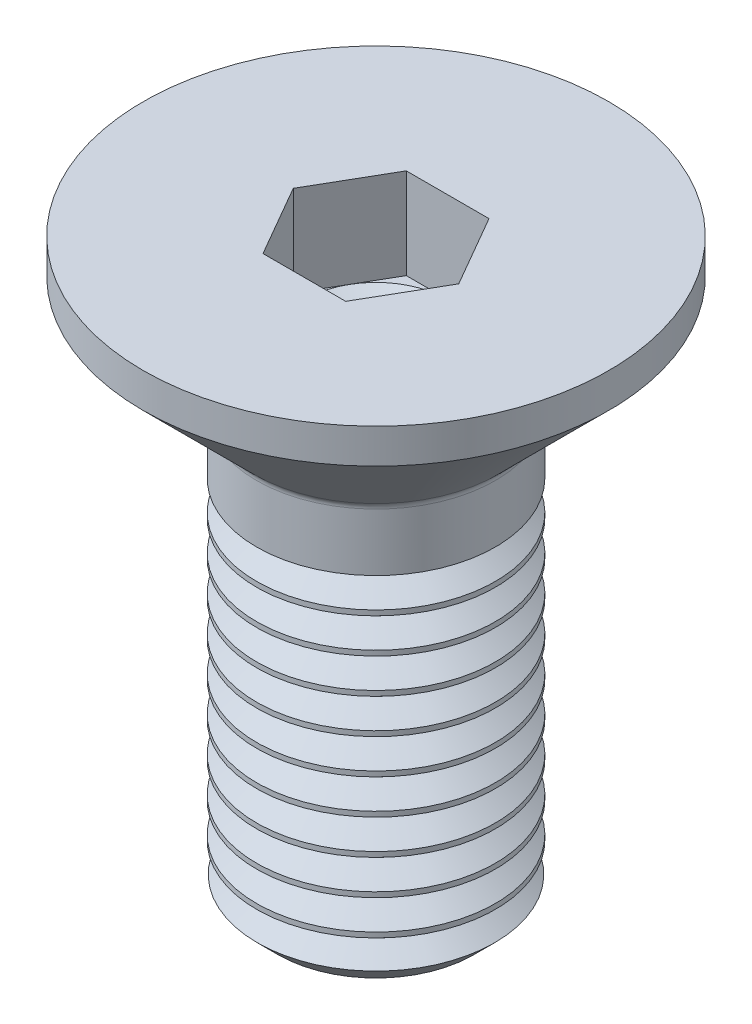
ISO-10303-21;
HEADER;
FILE_DESCRIPTION(('STEP AP214'),'2;1');
FILE_NAME('part.step','',(''),(''),'','','');
FILE_SCHEMA(('AUTOMOTIVE_DESIGN { 1 0 10303 214 1 1 1 1 }'));
ENDSEC;
DATA;
#1=APPLICATION_CONTEXT('core data for automotive mechanical design processes');
#2=APPLICATION_PROTOCOL_DEFINITION('international standard','automotive_design',2000,#1);
#3=PRODUCT_CONTEXT('',#1,'mechanical');
#4=PRODUCT('Part','Part','',(#3));
#5=PRODUCT_RELATED_PRODUCT_CATEGORY('part','',(#4));
#6=PRODUCT_DEFINITION_FORMATION('','',#4);
#7=PRODUCT_DEFINITION_CONTEXT('part definition',#1,'design');
#8=PRODUCT_DEFINITION('design','',#6,#7);
#9=PRODUCT_DEFINITION_SHAPE('','',#8);
#10=(LENGTH_UNIT() NAMED_UNIT(*) SI_UNIT(.MILLI.,.METRE.));
#11=(NAMED_UNIT(*) PLANE_ANGLE_UNIT() SI_UNIT($,.RADIAN.));
#12=(NAMED_UNIT(*) SI_UNIT($,.STERADIAN.) SOLID_ANGLE_UNIT());
#13=UNCERTAINTY_MEASURE_WITH_UNIT(LENGTH_MEASURE(1.E-05),#10,'distance_accuracy_value','');
#14=(GEOMETRIC_REPRESENTATION_CONTEXT(3) GLOBAL_UNCERTAINTY_ASSIGNED_CONTEXT((#13)) GLOBAL_UNIT_ASSIGNED_CONTEXT((#10,
#11,#12)) REPRESENTATION_CONTEXT('',''));
#15=CARTESIAN_POINT('',(0.,0.,0.));
#16=DIRECTION('',(0.,0.,1.));
#17=DIRECTION('',(1.,0.,0.));
#18=AXIS2_PLACEMENT_3D('',#15,#16,#17);
#19=CARTESIAN_POINT('',(5.99999999999416,6.00000000000003,0.));
#20=DIRECTION('',(-9.73290892325451E-13,1.,0.));
#21=DIRECTION('',(0.,0.,1.));
#22=AXIS2_PLACEMENT_3D('',#19,#20,#21);
#23=PLANE('',#22);
#24=CARTESIAN_POINT('',(5.99999999999416,6.00000000000003,0.));
#25=DIRECTION('',(-9.73290892325451E-13,1.,0.));
#26=DIRECTION('',(0.,0.,1.));
#27=AXIS2_PLACEMENT_3D('',#24,#25,#26);
#28=CIRCLE('',#27,4.875);
#29=CARTESIAN_POINT('',(5.99999999999416,6.00000000000003,4.875));
#30=VERTEX_POINT('',#29);
#31=EDGE_CURVE('E172',#30,#30,#28,.T.);
#32=ORIENTED_EDGE('',*,*,#31,.T.);
#33=EDGE_LOOP('',(#32));
#34=FACE_BOUND('',#33,.T.);
#35=DIRECTION('',(-0.5,-4.86645446162725E-13,-0.866025403784439));
#36=VECTOR('',#35,1.);
#37=CARTESIAN_POINT('',(5.13397459620972,5.99999999999918,1.5));
#38=LINE('',#37,#36);
#39=CARTESIAN_POINT('',(5.13397459620972,5.99999999999918,1.5));
#40=VERTEX_POINT('',#39);
#41=CARTESIAN_POINT('',(4.26794919242528,5.99999999999834,0.));
#42=VERTEX_POINT('',#41);
#43=EDGE_CURVE('E134',#40,#42,#38,.T.);
#44=ORIENTED_EDGE('',*,*,#43,.T.);
#45=DIRECTION('',(0.5,4.86645446162725E-13,-0.866025403784439));
#46=VECTOR('',#45,1.);
#47=CARTESIAN_POINT('',(4.26794919242528,5.99999999999834,0.));
#48=LINE('',#47,#46);
#49=CARTESIAN_POINT('',(5.13397459620972,5.99999999999918,-1.5));
#50=VERTEX_POINT('',#49);
#51=EDGE_CURVE('E64',#42,#50,#48,.T.);
#52=ORIENTED_EDGE('',*,*,#51,.T.);
#53=DIRECTION('',(1.,9.73290892325451E-13,0.));
#54=VECTOR('',#53,1.);
#55=CARTESIAN_POINT('',(5.13397459620972,5.99999999999918,-1.5));
#56=LINE('',#55,#54);
#57=CARTESIAN_POINT('',(6.86602540377859,6.00000000000087,-1.5));
#58=VERTEX_POINT('',#57);
#59=EDGE_CURVE('E146',#50,#58,#56,.T.);
#60=ORIENTED_EDGE('',*,*,#59,.T.);
#61=DIRECTION('',(0.500000000000001,4.86645446162726E-13,0.866025403784439));
#62=VECTOR('',#61,1.);
#63=CARTESIAN_POINT('',(6.86602540377859,6.00000000000087,-1.5));
#64=LINE('',#63,#62);
#65=CARTESIAN_POINT('',(7.73205080756303,6.00000000000171,0.));
#66=VERTEX_POINT('',#65);
#67=EDGE_CURVE('E476',#58,#66,#64,.T.);
#68=ORIENTED_EDGE('',*,*,#67,.T.);
#69=DIRECTION('',(-0.5,-4.86645446162726E-13,0.866025403784438));
#70=VECTOR('',#69,1.);
#71=CARTESIAN_POINT('',(7.73205080756303,6.00000000000171,0.));
#72=LINE('',#71,#70);
#73=CARTESIAN_POINT('',(6.86602540377859,6.00000000000087,1.5));
#74=VERTEX_POINT('',#73);
#75=EDGE_CURVE('E480',#66,#74,#72,.T.);
#76=ORIENTED_EDGE('',*,*,#75,.T.);
#77=DIRECTION('',(-1.,-9.73290892325451E-13,0.));
#78=VECTOR('',#77,1.);
#79=CARTESIAN_POINT('',(6.86602540377859,6.00000000000087,1.5));
#80=LINE('',#79,#78);
#81=EDGE_CURVE('E484',#74,#40,#80,.T.);
#82=ORIENTED_EDGE('',*,*,#81,.T.);
#83=EDGE_LOOP('',(#44,#52,#60,#68,#76,#82));
#84=FACE_BOUND('',#83,.T.);
#85=ADVANCED_FACE('F47',(#34,#84),#23,.T.);
#86=CARTESIAN_POINT('',(5.99999999999416,6.00000000000003,0.));
#87=DIRECTION('',(-9.73290892325451E-13,1.,0.));
#88=DIRECTION('',(0.,0.,1.));
#89=AXIS2_PLACEMENT_3D('',#86,#87,#88);
#90=CYLINDRICAL_SURFACE('',#89,4.875);
#91=CARTESIAN_POINT('',(5.99999999999486,5.27500000000002,0.));
#92=DIRECTION('',(-9.73290892325451E-13,1.,0.));
#93=DIRECTION('',(0.,0.,1.));
#94=AXIS2_PLACEMENT_3D('',#91,#92,#93);
#95=CIRCLE('',#94,4.875);
#96=CARTESIAN_POINT('',(5.99999999999486,5.27500000000002,4.875));
#97=VERTEX_POINT('',#96);
#98=EDGE_CURVE('E168',#97,#97,#95,.T.);
#99=ORIENTED_EDGE('',*,*,#98,.T.);
#100=EDGE_LOOP('',(#99));
#101=FACE_BOUND('',#100,.T.);
#102=ORIENTED_EDGE('',*,*,#31,.F.);
#103=EDGE_LOOP('',(#102));
#104=FACE_BOUND('',#103,.T.);
#105=ADVANCED_FACE('F198',(#101,#104),#90,.T.);
#106=CARTESIAN_POINT('',(5.99999999999486,5.27500000000002,0.));
#107=DIRECTION('',(-9.73290892325451E-13,1.,0.));
#108=DIRECTION('',(0.,0.,1.));
#109=AXIS2_PLACEMENT_3D('',#106,#107,#108);
#110=CONICAL_SURFACE('',#109,4.875,0.78539816339745);
#111=CARTESIAN_POINT('',(5.99999999999712,2.95857864376272,0.));
#112=DIRECTION('',(-9.73290892325451E-13,1.,0.));
#113=DIRECTION('',(0.,0.,1.));
#114=AXIS2_PLACEMENT_3D('',#111,#112,#113);
#115=CIRCLE('',#114,2.5585786437627);
#116=CARTESIAN_POINT('',(5.99999999999712,2.95857864376272,2.5585786437627));
#117=VERTEX_POINT('',#116);
#118=EDGE_CURVE('E57',#117,#117,#115,.T.);
#119=ORIENTED_EDGE('',*,*,#118,.T.);
#120=EDGE_LOOP('',(#119));
#121=FACE_BOUND('',#120,.T.);
#122=ORIENTED_EDGE('',*,*,#98,.F.);
#123=EDGE_LOOP('',(#122));
#124=FACE_BOUND('',#123,.T.);
#125=ADVANCED_FACE('F180',(#121,#124),#110,.T.);
#126=CARTESIAN_POINT('',(5.99999999999416,6.00000000000003,0.));
#127=DIRECTION('',(-9.73290892325451E-13,1.,0.));
#128=DIRECTION('',(0.,0.,1.));
#129=AXIS2_PLACEMENT_3D('',#126,#127,#128);
#130=CYLINDRICAL_SURFACE('',#129,2.5);
#131=CARTESIAN_POINT('',(5.99999999999843,1.61159135450335,0.));
#132=DIRECTION('',(-9.73413352960834E-13,1.,0.));
#133=DIRECTION('',(-1.,-9.73413352960834E-13,0.));
#134=AXIS2_PLACEMENT_3D('',#131,#132,#133);
#135=CIRCLE('',#134,2.5);
#136=CARTESIAN_POINT('',(3.49999999999843,1.61159135450091,0.));
#137=VERTEX_POINT('',#136);
#138=EDGE_CURVE('E443',#137,#137,#135,.T.);
#139=ORIENTED_EDGE('',*,*,#138,.T.);
#140=EDGE_LOOP('',(#139));
#141=FACE_BOUND('',#140,.T.);
#142=CARTESIAN_POINT('',(5.99999999999725,2.81715728752541,0.));
#143=DIRECTION('',(-9.73290892325451E-13,1.,0.));
#144=DIRECTION('',(0.,0.,1.));
#145=AXIS2_PLACEMENT_3D('',#142,#143,#144);
#146=CIRCLE('',#145,2.5);
#147=CARTESIAN_POINT('',(5.99999999999725,2.81715728752541,2.5));
#148=VERTEX_POINT('',#147);
#149=EDGE_CURVE('E11',#148,#148,#146,.F.);
#150=ORIENTED_EDGE('',*,*,#149,.T.);
#151=EDGE_LOOP('',(#150));
#152=FACE_BOUND('',#151,.T.);
#153=ADVANCED_FACE('F184',(#141,#152),#130,.T.);
#154=CARTESIAN_POINT('',(5.99999999999725,2.81715728752541,0.));
#155=DIRECTION('',(-9.73290892325451E-13,1.,0.));
#156=DIRECTION('',(0.,0.,1.));
#157=AXIS2_PLACEMENT_3D('',#154,#155,#156);
#158=TOROIDAL_SURFACE('',#157,2.70000000000001,0.2);
#159=ORIENTED_EDGE('',*,*,#149,.F.);
#160=EDGE_LOOP('',(#159));
#161=FACE_BOUND('',#160,.T.);
#162=ORIENTED_EDGE('',*,*,#118,.F.);
#163=EDGE_LOOP('',(#162));
#164=FACE_BOUND('',#163,.T.);
#165=ADVANCED_FACE('F49',(#161,#164),#158,.F.);
#166=CARTESIAN_POINT('',(4.26794919242713,4.09999999999834,0.));
#167=DIRECTION('',(0.866025403784439,8.42894638025866E-13,0.5));
#168=DIRECTION('',(-0.5,-4.86645446162725E-13,0.866025403784439));
#169=AXIS2_PLACEMENT_3D('',#166,#167,#168);
#170=PLANE('',#169);
#171=ORIENTED_EDGE('',*,*,#51,.F.);
#172=DIRECTION('',(-9.73290892325451E-13,1.,0.));
#173=VECTOR('',#172,1.);
#174=CARTESIAN_POINT('',(4.26794919242713,4.09999999999834,0.));
#175=LINE('',#174,#173);
#176=CARTESIAN_POINT('',(4.26794919242713,4.09999999999834,0.));
#177=VERTEX_POINT('',#176);
#178=EDGE_CURVE('E471',#177,#42,#175,.T.);
#179=ORIENTED_EDGE('',*,*,#178,.F.);
#180=DIRECTION('',(0.5,4.86645446162725E-13,-0.866025403784439));
#181=VECTOR('',#180,1.);
#182=CARTESIAN_POINT('',(4.26794919242713,4.09999999999834,0.));
#183=LINE('',#182,#181);
#184=CARTESIAN_POINT('',(4.70096189431935,4.09999999999876,-0.75));
#185=VERTEX_POINT('',#184);
#186=EDGE_CURVE('E129',#177,#185,#183,.T.);
#187=ORIENTED_EDGE('',*,*,#186,.T.);
#188=CARTESIAN_POINT('',(5.13397459621156,4.09999999999918,-1.5));
#189=VERTEX_POINT('',#188);
#190=EDGE_CURVE('E125',#185,#189,#183,.T.);
#191=ORIENTED_EDGE('',*,*,#190,.T.);
#192=DIRECTION('',(-9.73290892325451E-13,1.,0.));
#193=VECTOR('',#192,1.);
#194=CARTESIAN_POINT('',(5.13397459621156,4.09999999999918,-1.5));
#195=LINE('',#194,#193);
#196=EDGE_CURVE('E127',#189,#50,#195,.T.);
#197=ORIENTED_EDGE('',*,*,#196,.T.);
#198=EDGE_LOOP('',(#171,#179,#187,#191,#197));
#199=FACE_BOUND('',#198,.T.);
#200=ADVANCED_FACE('F126',(#199),#170,.T.);
#201=CARTESIAN_POINT('',(5.13397459621156,4.09999999999918,-1.5));
#202=DIRECTION('',(0.,0.,1.));
#203=DIRECTION('',(-1.,-9.73290892325451E-13,0.));
#204=AXIS2_PLACEMENT_3D('',#201,#202,#203);
#205=PLANE('',#204);
#206=ORIENTED_EDGE('',*,*,#59,.F.);
#207=ORIENTED_EDGE('',*,*,#196,.F.);
#208=DIRECTION('',(1.,9.73290892325451E-13,0.));
#209=VECTOR('',#208,1.);
#210=CARTESIAN_POINT('',(5.13397459621156,4.09999999999918,-1.5));
#211=LINE('',#210,#209);
#212=CARTESIAN_POINT('',(5.999999999996,4.10000000000003,-1.5));
#213=VERTEX_POINT('',#212);
#214=EDGE_CURVE('E72',#189,#213,#211,.T.);
#215=ORIENTED_EDGE('',*,*,#214,.T.);
#216=CARTESIAN_POINT('',(6.86602540378044,4.10000000000087,-1.5));
#217=VERTEX_POINT('',#216);
#218=EDGE_CURVE('E141',#213,#217,#211,.T.);
#219=ORIENTED_EDGE('',*,*,#218,.T.);
#220=DIRECTION('',(-9.73290892325451E-13,1.,0.));
#221=VECTOR('',#220,1.);
#222=CARTESIAN_POINT('',(6.86602540378044,4.10000000000087,-1.5));
#223=LINE('',#222,#221);
#224=EDGE_CURVE('E149',#217,#58,#223,.T.);
#225=ORIENTED_EDGE('',*,*,#224,.T.);
#226=EDGE_LOOP('',(#206,#207,#215,#219,#225));
#227=FACE_BOUND('',#226,.T.);
#228=ADVANCED_FACE('F143',(#227),#205,.T.);
#229=CARTESIAN_POINT('',(6.86602540378044,4.10000000000087,-1.5));
#230=DIRECTION('',(-0.866025403784439,-8.42894638025865E-13,0.5));
#231=DIRECTION('',(-0.500000000000001,-4.86645446162726E-13,-0.866025403784438));
#232=AXIS2_PLACEMENT_3D('',#229,#230,#231);
#233=PLANE('',#232);
#234=ORIENTED_EDGE('',*,*,#67,.F.);
#235=ORIENTED_EDGE('',*,*,#224,.F.);
#236=DIRECTION('',(0.500000000000001,4.86645446162726E-13,0.866025403784439));
#237=VECTOR('',#236,1.);
#238=CARTESIAN_POINT('',(6.86602540378044,4.10000000000087,-1.5));
#239=LINE('',#238,#237);
#240=CARTESIAN_POINT('',(7.29903810567266,4.10000000000129,-0.75));
#241=VERTEX_POINT('',#240);
#242=EDGE_CURVE('E452',#217,#241,#239,.T.);
#243=ORIENTED_EDGE('',*,*,#242,.T.);
#244=CARTESIAN_POINT('',(7.73205080756488,4.10000000000171,0.));
#245=VERTEX_POINT('',#244);
#246=EDGE_CURVE('E140',#241,#245,#239,.T.);
#247=ORIENTED_EDGE('',*,*,#246,.T.);
#248=DIRECTION('',(-9.73290892325451E-13,1.,0.));
#249=VECTOR('',#248,1.);
#250=CARTESIAN_POINT('',(7.73205080756488,4.10000000000171,0.));
#251=LINE('',#250,#249);
#252=EDGE_CURVE('E157',#245,#66,#251,.T.);
#253=ORIENTED_EDGE('',*,*,#252,.T.);
#254=EDGE_LOOP('',(#234,#235,#243,#247,#253));
#255=FACE_BOUND('',#254,.T.);
#256=ADVANCED_FACE('F226',(#255),#233,.T.);
#257=CARTESIAN_POINT('',(7.73205080756488,4.10000000000171,0.));
#258=DIRECTION('',(-0.866025403784439,-8.42894638025866E-13,-0.5));
#259=DIRECTION('',(0.5,4.86645446162726E-13,-0.866025403784439));
#260=AXIS2_PLACEMENT_3D('',#257,#258,#259);
#261=PLANE('',#260);
#262=ORIENTED_EDGE('',*,*,#75,.F.);
#263=ORIENTED_EDGE('',*,*,#252,.F.);
#264=DIRECTION('',(-0.5,-4.86645446162726E-13,0.866025403784438));
#265=VECTOR('',#264,1.);
#266=CARTESIAN_POINT('',(7.73205080756488,4.10000000000171,0.));
#267=LINE('',#266,#265);
#268=CARTESIAN_POINT('',(7.29903810567266,4.10000000000129,0.75));
#269=VERTEX_POINT('',#268);
#270=EDGE_CURVE('E457',#245,#269,#267,.T.);
#271=ORIENTED_EDGE('',*,*,#270,.T.);
#272=CARTESIAN_POINT('',(6.86602540378044,4.10000000000087,1.5));
#273=VERTEX_POINT('',#272);
#274=EDGE_CURVE('E456',#269,#273,#267,.T.);
#275=ORIENTED_EDGE('',*,*,#274,.T.);
#276=DIRECTION('',(-9.73290892325451E-13,1.,0.));
#277=VECTOR('',#276,1.);
#278=CARTESIAN_POINT('',(6.86602540378044,4.10000000000087,1.5));
#279=LINE('',#278,#277);
#280=EDGE_CURVE('E497',#273,#74,#279,.T.);
#281=ORIENTED_EDGE('',*,*,#280,.T.);
#282=EDGE_LOOP('',(#262,#263,#271,#275,#281));
#283=FACE_BOUND('',#282,.T.);
#284=ADVANCED_FACE('F229',(#283),#261,.T.);
#285=CARTESIAN_POINT('',(6.86602540378044,4.10000000000087,1.5));
#286=DIRECTION('',(0.,0.,-1.));
#287=DIRECTION('',(-9.73290892325451E-13,1.,0.));
#288=AXIS2_PLACEMENT_3D('',#285,#286,#287);
#289=PLANE('',#288);
#290=ORIENTED_EDGE('',*,*,#81,.F.);
#291=ORIENTED_EDGE('',*,*,#280,.F.);
#292=DIRECTION('',(-1.,-9.73290892325451E-13,0.));
#293=VECTOR('',#292,1.);
#294=CARTESIAN_POINT('',(6.86602540378044,4.10000000000087,1.5));
#295=LINE('',#294,#293);
#296=CARTESIAN_POINT('',(5.999999999996,4.10000000000003,1.5));
#297=VERTEX_POINT('',#296);
#298=EDGE_CURVE('E462',#273,#297,#295,.T.);
#299=ORIENTED_EDGE('',*,*,#298,.T.);
#300=CARTESIAN_POINT('',(5.13397459621156,4.09999999999918,1.5));
#301=VERTEX_POINT('',#300);
#302=EDGE_CURVE('E461',#297,#301,#295,.T.);
#303=ORIENTED_EDGE('',*,*,#302,.T.);
#304=DIRECTION('',(-9.73290892325451E-13,1.,0.));
#305=VECTOR('',#304,1.);
#306=CARTESIAN_POINT('',(5.13397459621156,4.09999999999918,1.5));
#307=LINE('',#306,#305);
#308=EDGE_CURVE('E493',#301,#40,#307,.T.);
#309=ORIENTED_EDGE('',*,*,#308,.T.);
#310=EDGE_LOOP('',(#290,#291,#299,#303,#309));
#311=FACE_BOUND('',#310,.T.);
#312=ADVANCED_FACE('F233',(#311),#289,.T.);
#313=CARTESIAN_POINT('',(5.13397459621156,4.09999999999918,1.5));
#314=DIRECTION('',(0.866025403784439,8.42894638025866E-13,-0.5));
#315=DIRECTION('',(0.5,4.86645446162726E-13,0.866025403784439));
#316=AXIS2_PLACEMENT_3D('',#313,#314,#315);
#317=PLANE('',#316);
#318=ORIENTED_EDGE('',*,*,#43,.F.);
#319=ORIENTED_EDGE('',*,*,#308,.F.);
#320=DIRECTION('',(-0.5,-4.86645446162725E-13,-0.866025403784439));
#321=VECTOR('',#320,1.);
#322=CARTESIAN_POINT('',(5.13397459621156,4.09999999999918,1.5));
#323=LINE('',#322,#321);
#324=CARTESIAN_POINT('',(4.70096189431935,4.09999999999876,0.75));
#325=VERTEX_POINT('',#324);
#326=EDGE_CURVE('E467',#301,#325,#323,.T.);
#327=ORIENTED_EDGE('',*,*,#326,.T.);
#328=EDGE_CURVE('E466',#325,#177,#323,.T.);
#329=ORIENTED_EDGE('',*,*,#328,.T.);
#330=ORIENTED_EDGE('',*,*,#178,.T.);
#331=EDGE_LOOP('',(#318,#319,#327,#329,#330));
#332=FACE_BOUND('',#331,.T.);
#333=ADVANCED_FACE('F237',(#332),#317,.T.);
#334=CARTESIAN_POINT('',(5.13397459621156,4.09999999999918,-1.5));
#335=DIRECTION('',(9.73290892325451E-13,-1.,0.));
#336=DIRECTION('',(0.,0.,-1.));
#337=AXIS2_PLACEMENT_3D('',#334,#335,#336);
#338=PLANE('',#337);
#339=ORIENTED_EDGE('',*,*,#214,.F.);
#340=ORIENTED_EDGE('',*,*,#190,.F.);
#341=CARTESIAN_POINT('',(5.999999999996,4.10000000000003,0.));
#342=DIRECTION('',(-9.73290892325451E-13,1.,0.));
#343=DIRECTION('',(0.,0.,1.));
#344=AXIS2_PLACEMENT_3D('',#341,#342,#343);
#345=CIRCLE('',#344,1.5);
#346=EDGE_CURVE('E137',#213,#185,#345,.T.);
#347=ORIENTED_EDGE('',*,*,#346,.F.);
#348=EDGE_LOOP('',(#339,#340,#347));
#349=FACE_BOUND('',#348,.T.);
#350=ADVANCED_FACE('F136',(#349),#338,.F.);
#351=ORIENTED_EDGE('',*,*,#186,.F.);
#352=ORIENTED_EDGE('',*,*,#328,.F.);
#353=EDGE_CURVE('E154',#185,#325,#345,.T.);
#354=ORIENTED_EDGE('',*,*,#353,.F.);
#355=EDGE_LOOP('',(#351,#352,#354));
#356=FACE_BOUND('',#355,.T.);
#357=ADVANCED_FACE('F244',(#356),#338,.F.);
#358=ORIENTED_EDGE('',*,*,#326,.F.);
#359=ORIENTED_EDGE('',*,*,#302,.F.);
#360=EDGE_CURVE('E148',#325,#297,#345,.T.);
#361=ORIENTED_EDGE('',*,*,#360,.F.);
#362=EDGE_LOOP('',(#358,#359,#361));
#363=FACE_BOUND('',#362,.T.);
#364=ADVANCED_FACE('F536',(#363),#338,.F.);
#365=ORIENTED_EDGE('',*,*,#298,.F.);
#366=ORIENTED_EDGE('',*,*,#274,.F.);
#367=EDGE_CURVE('E156',#297,#269,#345,.T.);
#368=ORIENTED_EDGE('',*,*,#367,.F.);
#369=EDGE_LOOP('',(#365,#366,#368));
#370=FACE_BOUND('',#369,.T.);
#371=ADVANCED_FACE('F534',(#370),#338,.F.);
#372=ORIENTED_EDGE('',*,*,#270,.F.);
#373=ORIENTED_EDGE('',*,*,#246,.F.);
#374=EDGE_CURVE('E164',#269,#241,#345,.T.);
#375=ORIENTED_EDGE('',*,*,#374,.F.);
#376=EDGE_LOOP('',(#372,#373,#375));
#377=FACE_BOUND('',#376,.T.);
#378=ADVANCED_FACE('F530',(#377),#338,.F.);
#379=ORIENTED_EDGE('',*,*,#242,.F.);
#380=ORIENTED_EDGE('',*,*,#218,.F.);
#381=EDGE_CURVE('E526',#241,#213,#345,.T.);
#382=ORIENTED_EDGE('',*,*,#381,.F.);
#383=EDGE_LOOP('',(#379,#380,#382));
#384=FACE_BOUND('',#383,.T.);
#385=ADVANCED_FACE('F221',(#384),#338,.F.);
#386=CARTESIAN_POINT('',(5.999999999996,4.10000000000003,0.));
#387=DIRECTION('',(-9.73290892325451E-13,1.,0.));
#388=DIRECTION('',(0.,0.,1.));
#389=AXIS2_PLACEMENT_3D('',#386,#387,#388);
#390=CONICAL_SURFACE('',#389,1.5,1.04719755119659);
#391=CARTESIAN_POINT('',(5.99999999999685,3.23397459621558,0.));
#392=VERTEX_POINT('',#391);
#393=VERTEX_LOOP('',#392);
#394=FACE_BOUND('',#393,.T.);
#395=ORIENTED_EDGE('',*,*,#367,.T.);
#396=ORIENTED_EDGE('',*,*,#374,.T.);
#397=ORIENTED_EDGE('',*,*,#381,.T.);
#398=ORIENTED_EDGE('',*,*,#346,.T.);
#399=ORIENTED_EDGE('',*,*,#353,.T.);
#400=ORIENTED_EDGE('',*,*,#360,.T.);
#401=EDGE_LOOP('',(#395,#396,#397,#398,#399,#400));
#402=FACE_BOUND('',#401,.T.);
#403=ADVANCED_FACE('F218',(#394,#402),#390,.F.);
#404=CARTESIAN_POINT('',(5.99999999999903,0.988406645496705,0.));
#405=DIRECTION('',(9.73413352960834E-13,-1.,0.));
#406=DIRECTION('',(1.,9.73413352960834E-13,0.));
#407=AXIS2_PLACEMENT_3D('',#404,#405,#406);
#408=CONICAL_SURFACE('',#407,2.5,0.959931088596883);
#409=CARTESIAN_POINT('',(5.99999999999873,1.29999900000002,0.));
#410=DIRECTION('',(-9.73413352960834E-13,1.,0.));
#411=DIRECTION('',(-1.,-9.73413352960834E-13,0.));
#412=AXIS2_PLACEMENT_3D('',#409,#410,#411);
#413=CIRCLE('',#412,2.055);
#414=CARTESIAN_POINT('',(3.94499999999873,1.29999899999802,0.));
#415=VERTEX_POINT('',#414);
#416=EDGE_CURVE('E439',#415,#415,#413,.T.);
#417=ORIENTED_EDGE('',*,*,#416,.F.);
#418=EDGE_LOOP('',(#417));
#419=FACE_BOUND('',#418,.T.);
#420=CARTESIAN_POINT('',(5.99999999999903,0.988406645496705,0.));
#421=DIRECTION('',(-9.73413352960834E-13,1.,0.));
#422=DIRECTION('',(-1.,-9.73413352960834E-13,0.));
#423=AXIS2_PLACEMENT_3D('',#420,#421,#422);
#424=CIRCLE('',#423,2.5);
#425=CARTESIAN_POINT('',(3.49999999999903,0.988406645494271,0.));
#426=VERTEX_POINT('',#425);
#427=EDGE_CURVE('E447',#426,#426,#424,.T.);
#428=ORIENTED_EDGE('',*,*,#427,.T.);
#429=EDGE_LOOP('',(#428));
#430=FACE_BOUND('',#429,.T.);
#431=ADVANCED_FACE('F220',(#419,#430),#408,.T.);
#432=CARTESIAN_POINT('',(5.99999999999873,1.29999900000002,0.));
#433=DIRECTION('',(-9.73413352960834E-13,1.,0.));
#434=DIRECTION('',(-1.,-9.73413352960834E-13,0.));
#435=AXIS2_PLACEMENT_3D('',#432,#433,#434);
#436=CONICAL_SURFACE('',#435,2.055,0.959931088596877);
#437=ORIENTED_EDGE('',*,*,#138,.F.);
#438=EDGE_LOOP('',(#437));
#439=FACE_BOUND('',#438,.T.);
#440=ORIENTED_EDGE('',*,*,#416,.T.);
#441=EDGE_LOOP('',(#440));
#442=FACE_BOUND('',#441,.T.);
#443=ADVANCED_FACE('F247',(#439,#442),#436,.T.);
#444=CARTESIAN_POINT('',(5.99999999999914,0.881591354503349,0.));
#445=DIRECTION('',(-9.73413352960834E-13,1.,0.));
#446=DIRECTION('',(-1.,-9.73413352960834E-13,0.));
#447=AXIS2_PLACEMENT_3D('',#444,#445,#446);
#448=CIRCLE('',#447,2.5);
#449=CARTESIAN_POINT('',(3.49999999999914,0.881591354500915,0.));
#450=VERTEX_POINT('',#449);
#451=EDGE_CURVE('E431',#450,#450,#448,.T.);
#452=ORIENTED_EDGE('',*,*,#451,.T.);
#453=EDGE_LOOP('',(#452));
#454=FACE_BOUND('',#453,.T.);
#455=ORIENTED_EDGE('',*,*,#427,.F.);
#456=EDGE_LOOP('',(#455));
#457=FACE_BOUND('',#456,.T.);
#458=ADVANCED_FACE('F195',(#454,#457),#130,.T.);
#459=CARTESIAN_POINT('',(5.99999999999975,0.258406645496705,0.));
#460=DIRECTION('',(9.73413352960834E-13,-1.,0.));
#461=DIRECTION('',(1.,9.73413352960834E-13,0.));
#462=AXIS2_PLACEMENT_3D('',#459,#460,#461);
#463=CONICAL_SURFACE('',#462,2.5,0.959931088596883);
#464=CARTESIAN_POINT('',(5.99999999999944,0.569999000000025,0.));
#465=DIRECTION('',(-9.73413352960834E-13,1.,0.));
#466=DIRECTION('',(-1.,-9.73413352960834E-13,0.));
#467=AXIS2_PLACEMENT_3D('',#464,#465,#466);
#468=CIRCLE('',#467,2.055);
#469=CARTESIAN_POINT('',(3.94499999999944,0.569998999998025,0.));
#470=VERTEX_POINT('',#469);
#471=EDGE_CURVE('E427',#470,#470,#468,.T.);
#472=ORIENTED_EDGE('',*,*,#471,.F.);
#473=EDGE_LOOP('',(#472));
#474=FACE_BOUND('',#473,.T.);
#475=CARTESIAN_POINT('',(5.99999999999975,0.258406645496705,0.));
#476=DIRECTION('',(-9.73413352960834E-13,1.,0.));
#477=DIRECTION('',(-1.,-9.73413352960834E-13,0.));
#478=AXIS2_PLACEMENT_3D('',#475,#476,#477);
#479=CIRCLE('',#478,2.5);
#480=CARTESIAN_POINT('',(3.49999999999974,0.258406645494271,0.));
#481=VERTEX_POINT('',#480);
#482=EDGE_CURVE('E435',#481,#481,#479,.T.);
#483=ORIENTED_EDGE('',*,*,#482,.T.);
#484=EDGE_LOOP('',(#483));
#485=FACE_BOUND('',#484,.T.);
#486=ADVANCED_FACE('F252',(#474,#485),#463,.T.);
#487=CARTESIAN_POINT('',(5.99999999999944,0.569999000000025,0.));
#488=DIRECTION('',(-9.73413352960834E-13,1.,0.));
#489=DIRECTION('',(-1.,-9.73413352960834E-13,0.));
#490=AXIS2_PLACEMENT_3D('',#487,#488,#489);
#491=CONICAL_SURFACE('',#490,2.055,0.959931088596877);
#492=ORIENTED_EDGE('',*,*,#451,.F.);
#493=EDGE_LOOP('',(#492));
#494=FACE_BOUND('',#493,.T.);
#495=ORIENTED_EDGE('',*,*,#471,.T.);
#496=EDGE_LOOP('',(#495));
#497=FACE_BOUND('',#496,.T.);
#498=ADVANCED_FACE('F255',(#494,#497),#491,.T.);
#499=CARTESIAN_POINT('',(5.99999999999985,0.151591354503349,0.));
#500=DIRECTION('',(-9.73413352960834E-13,1.,0.));
#501=DIRECTION('',(-1.,-9.73413352960834E-13,0.));
#502=AXIS2_PLACEMENT_3D('',#499,#500,#501);
#503=CIRCLE('',#502,2.5);
#504=CARTESIAN_POINT('',(3.49999999999985,0.151591354500915,0.));
#505=VERTEX_POINT('',#504);
#506=EDGE_CURVE('E419',#505,#505,#503,.T.);
#507=ORIENTED_EDGE('',*,*,#506,.T.);
#508=EDGE_LOOP('',(#507));
#509=FACE_BOUND('',#508,.T.);
#510=ORIENTED_EDGE('',*,*,#482,.F.);
#511=EDGE_LOOP('',(#510));
#512=FACE_BOUND('',#511,.T.);
#513=ADVANCED_FACE('F259',(#509,#512),#130,.T.);
#514=CARTESIAN_POINT('',(6.00000000000046,-0.471593354503296,0.));
#515=DIRECTION('',(9.73413352960834E-13,-1.,0.));
#516=DIRECTION('',(1.,9.73413352960834E-13,0.));
#517=AXIS2_PLACEMENT_3D('',#514,#515,#516);
#518=CONICAL_SURFACE('',#517,2.5,0.959931088596883);
#519=CARTESIAN_POINT('',(6.00000000000015,-0.160000999999976,0.));
#520=DIRECTION('',(-9.73413352960834E-13,1.,0.));
#521=DIRECTION('',(-1.,-9.73413352960834E-13,0.));
#522=AXIS2_PLACEMENT_3D('',#519,#520,#521);
#523=CIRCLE('',#522,2.055);
#524=CARTESIAN_POINT('',(3.94500000000015,-0.160001000001976,0.));
#525=VERTEX_POINT('',#524);
#526=EDGE_CURVE('E415',#525,#525,#523,.T.);
#527=ORIENTED_EDGE('',*,*,#526,.F.);
#528=EDGE_LOOP('',(#527));
#529=FACE_BOUND('',#528,.T.);
#530=CARTESIAN_POINT('',(6.00000000000046,-0.471593354503296,0.));
#531=DIRECTION('',(-9.73413352960834E-13,1.,0.));
#532=DIRECTION('',(-1.,-9.73413352960834E-13,0.));
#533=AXIS2_PLACEMENT_3D('',#530,#531,#532);
#534=CIRCLE('',#533,2.5);
#535=CARTESIAN_POINT('',(3.50000000000045,-0.471593354505729,0.));
#536=VERTEX_POINT('',#535);
#537=EDGE_CURVE('E423',#536,#536,#534,.T.);
#538=ORIENTED_EDGE('',*,*,#537,.T.);
#539=EDGE_LOOP('',(#538));
#540=FACE_BOUND('',#539,.T.);
#541=ADVANCED_FACE('F261',(#529,#540),#518,.T.);
#542=CARTESIAN_POINT('',(6.00000000000015,-0.160000999999976,0.));
#543=DIRECTION('',(-9.73413352960834E-13,1.,0.));
#544=DIRECTION('',(-1.,-9.73413352960834E-13,0.));
#545=AXIS2_PLACEMENT_3D('',#542,#543,#544);
#546=CONICAL_SURFACE('',#545,2.055,0.959931088596877);
#547=ORIENTED_EDGE('',*,*,#506,.F.);
#548=EDGE_LOOP('',(#547));
#549=FACE_BOUND('',#548,.T.);
#550=ORIENTED_EDGE('',*,*,#526,.T.);
#551=EDGE_LOOP('',(#550));
#552=FACE_BOUND('',#551,.T.);
#553=ADVANCED_FACE('F264',(#549,#552),#546,.T.);
#554=CARTESIAN_POINT('',(6.00000000000056,-0.578408645496652,0.));
#555=DIRECTION('',(-9.73413352960834E-13,1.,0.));
#556=DIRECTION('',(-1.,-9.73413352960834E-13,0.));
#557=AXIS2_PLACEMENT_3D('',#554,#555,#556);
#558=CIRCLE('',#557,2.5);
#559=CARTESIAN_POINT('',(3.50000000000056,-0.578408645499086,0.));
#560=VERTEX_POINT('',#559);
#561=EDGE_CURVE('E407',#560,#560,#558,.T.);
#562=ORIENTED_EDGE('',*,*,#561,.T.);
#563=EDGE_LOOP('',(#562));
#564=FACE_BOUND('',#563,.T.);
#565=ORIENTED_EDGE('',*,*,#537,.F.);
#566=EDGE_LOOP('',(#565));
#567=FACE_BOUND('',#566,.T.);
#568=ADVANCED_FACE('F268',(#564,#567),#130,.T.);
#569=CARTESIAN_POINT('',(6.00000000000117,-1.2015933545033,0.));
#570=DIRECTION('',(9.73413352960834E-13,-1.,0.));
#571=DIRECTION('',(1.,9.73413352960834E-13,0.));
#572=AXIS2_PLACEMENT_3D('',#569,#570,#571);
#573=CONICAL_SURFACE('',#572,2.5,0.959931088596883);
#574=CARTESIAN_POINT('',(6.00000000000086,-0.890000999999976,0.));
#575=DIRECTION('',(-9.73413352960834E-13,1.,0.));
#576=DIRECTION('',(-1.,-9.73413352960834E-13,0.));
#577=AXIS2_PLACEMENT_3D('',#574,#575,#576);
#578=CIRCLE('',#577,2.055);
#579=CARTESIAN_POINT('',(3.94500000000086,-0.890001000001977,0.));
#580=VERTEX_POINT('',#579);
#581=EDGE_CURVE('E403',#580,#580,#578,.T.);
#582=ORIENTED_EDGE('',*,*,#581,.F.);
#583=EDGE_LOOP('',(#582));
#584=FACE_BOUND('',#583,.T.);
#585=CARTESIAN_POINT('',(6.00000000000117,-1.2015933545033,0.));
#586=DIRECTION('',(-9.73413352960834E-13,1.,0.));
#587=DIRECTION('',(-1.,-9.73413352960834E-13,0.));
#588=AXIS2_PLACEMENT_3D('',#585,#586,#587);
#589=CIRCLE('',#588,2.5);
#590=CARTESIAN_POINT('',(3.50000000000116,-1.20159335450573,0.));
#591=VERTEX_POINT('',#590);
#592=EDGE_CURVE('E411',#591,#591,#589,.T.);
#593=ORIENTED_EDGE('',*,*,#592,.T.);
#594=EDGE_LOOP('',(#593));
#595=FACE_BOUND('',#594,.T.);
#596=ADVANCED_FACE('F270',(#584,#595),#573,.T.);
#597=CARTESIAN_POINT('',(6.00000000000086,-0.890000999999976,0.));
#598=DIRECTION('',(-9.73413352960834E-13,1.,0.));
#599=DIRECTION('',(-1.,-9.73413352960834E-13,0.));
#600=AXIS2_PLACEMENT_3D('',#597,#598,#599);
#601=CONICAL_SURFACE('',#600,2.055,0.959931088596877);
#602=ORIENTED_EDGE('',*,*,#561,.F.);
#603=EDGE_LOOP('',(#602));
#604=FACE_BOUND('',#603,.T.);
#605=ORIENTED_EDGE('',*,*,#581,.T.);
#606=EDGE_LOOP('',(#605));
#607=FACE_BOUND('',#606,.T.);
#608=ADVANCED_FACE('F273',(#604,#607),#601,.T.);
#609=CARTESIAN_POINT('',(6.00000000000127,-1.30840864549665,0.));
#610=DIRECTION('',(-9.73413352960834E-13,1.,0.));
#611=DIRECTION('',(-1.,-9.73413352960834E-13,0.));
#612=AXIS2_PLACEMENT_3D('',#609,#610,#611);
#613=CIRCLE('',#612,2.5);
#614=CARTESIAN_POINT('',(3.50000000000127,-1.30840864549909,0.));
#615=VERTEX_POINT('',#614);
#616=EDGE_CURVE('E395',#615,#615,#613,.T.);
#617=ORIENTED_EDGE('',*,*,#616,.T.);
#618=EDGE_LOOP('',(#617));
#619=FACE_BOUND('',#618,.T.);
#620=ORIENTED_EDGE('',*,*,#592,.F.);
#621=EDGE_LOOP('',(#620));
#622=FACE_BOUND('',#621,.T.);
#623=ADVANCED_FACE('F277',(#619,#622),#130,.T.);
#624=CARTESIAN_POINT('',(6.00000000000188,-1.9315933545033,0.));
#625=DIRECTION('',(9.73413352960834E-13,-1.,0.));
#626=DIRECTION('',(1.,9.73413352960834E-13,0.));
#627=AXIS2_PLACEMENT_3D('',#624,#625,#626);
#628=CONICAL_SURFACE('',#627,2.5,0.959931088596883);
#629=CARTESIAN_POINT('',(6.00000000000157,-1.62000099999998,0.));
#630=DIRECTION('',(-9.73413352960834E-13,1.,0.));
#631=DIRECTION('',(-1.,-9.73413352960834E-13,0.));
#632=AXIS2_PLACEMENT_3D('',#629,#630,#631);
#633=CIRCLE('',#632,2.055);
#634=CARTESIAN_POINT('',(3.94500000000157,-1.62000100000198,0.));
#635=VERTEX_POINT('',#634);
#636=EDGE_CURVE('E391',#635,#635,#633,.T.);
#637=ORIENTED_EDGE('',*,*,#636,.F.);
#638=EDGE_LOOP('',(#637));
#639=FACE_BOUND('',#638,.T.);
#640=CARTESIAN_POINT('',(6.00000000000188,-1.9315933545033,0.));
#641=DIRECTION('',(-9.73413352960834E-13,1.,0.));
#642=DIRECTION('',(-1.,-9.73413352960834E-13,0.));
#643=AXIS2_PLACEMENT_3D('',#640,#641,#642);
#644=CIRCLE('',#643,2.5);
#645=CARTESIAN_POINT('',(3.50000000000187,-1.93159335450573,0.));
#646=VERTEX_POINT('',#645);
#647=EDGE_CURVE('E399',#646,#646,#644,.T.);
#648=ORIENTED_EDGE('',*,*,#647,.T.);
#649=EDGE_LOOP('',(#648));
#650=FACE_BOUND('',#649,.T.);
#651=ADVANCED_FACE('F279',(#639,#650),#628,.T.);
#652=CARTESIAN_POINT('',(6.00000000000157,-1.62000099999998,0.));
#653=DIRECTION('',(-9.73413352960834E-13,1.,0.));
#654=DIRECTION('',(-1.,-9.73413352960834E-13,0.));
#655=AXIS2_PLACEMENT_3D('',#652,#653,#654);
#656=CONICAL_SURFACE('',#655,2.055,0.959931088596877);
#657=ORIENTED_EDGE('',*,*,#616,.F.);
#658=EDGE_LOOP('',(#657));
#659=FACE_BOUND('',#658,.T.);
#660=ORIENTED_EDGE('',*,*,#636,.T.);
#661=EDGE_LOOP('',(#660));
#662=FACE_BOUND('',#661,.T.);
#663=ADVANCED_FACE('F282',(#659,#662),#656,.T.);
#664=CARTESIAN_POINT('',(6.00000000000198,-2.03840864549665,0.));
#665=DIRECTION('',(-9.73413352960834E-13,1.,0.));
#666=DIRECTION('',(-1.,-9.73413352960834E-13,0.));
#667=AXIS2_PLACEMENT_3D('',#664,#665,#666);
#668=CIRCLE('',#667,2.5);
#669=CARTESIAN_POINT('',(3.50000000000198,-2.03840864549909,0.));
#670=VERTEX_POINT('',#669);
#671=EDGE_CURVE('E383',#670,#670,#668,.T.);
#672=ORIENTED_EDGE('',*,*,#671,.T.);
#673=EDGE_LOOP('',(#672));
#674=FACE_BOUND('',#673,.T.);
#675=ORIENTED_EDGE('',*,*,#647,.F.);
#676=EDGE_LOOP('',(#675));
#677=FACE_BOUND('',#676,.T.);
#678=ADVANCED_FACE('F286',(#674,#677),#130,.T.);
#679=CARTESIAN_POINT('',(6.00000000000259,-2.6615933545033,0.));
#680=DIRECTION('',(9.73413352960834E-13,-1.,0.));
#681=DIRECTION('',(1.,9.73413352960834E-13,0.));
#682=AXIS2_PLACEMENT_3D('',#679,#680,#681);
#683=CONICAL_SURFACE('',#682,2.5,0.959931088596883);
#684=CARTESIAN_POINT('',(6.00000000000228,-2.35000099999997,0.));
#685=DIRECTION('',(-9.73413352960834E-13,1.,0.));
#686=DIRECTION('',(-1.,-9.73413352960834E-13,0.));
#687=AXIS2_PLACEMENT_3D('',#684,#685,#686);
#688=CIRCLE('',#687,2.055);
#689=CARTESIAN_POINT('',(3.94500000000228,-2.35000100000198,0.));
#690=VERTEX_POINT('',#689);
#691=EDGE_CURVE('E379',#690,#690,#688,.T.);
#692=ORIENTED_EDGE('',*,*,#691,.F.);
#693=EDGE_LOOP('',(#692));
#694=FACE_BOUND('',#693,.T.);
#695=CARTESIAN_POINT('',(6.00000000000259,-2.6615933545033,0.));
#696=DIRECTION('',(-9.73413352960834E-13,1.,0.));
#697=DIRECTION('',(-1.,-9.73413352960834E-13,0.));
#698=AXIS2_PLACEMENT_3D('',#695,#696,#697);
#699=CIRCLE('',#698,2.5);
#700=CARTESIAN_POINT('',(3.50000000000259,-2.66159335450573,0.));
#701=VERTEX_POINT('',#700);
#702=EDGE_CURVE('E387',#701,#701,#699,.T.);
#703=ORIENTED_EDGE('',*,*,#702,.T.);
#704=EDGE_LOOP('',(#703));
#705=FACE_BOUND('',#704,.T.);
#706=ADVANCED_FACE('F288',(#694,#705),#683,.T.);
#707=CARTESIAN_POINT('',(6.00000000000228,-2.35000099999997,0.));
#708=DIRECTION('',(-9.73413352960834E-13,1.,0.));
#709=DIRECTION('',(-1.,-9.73413352960834E-13,0.));
#710=AXIS2_PLACEMENT_3D('',#707,#708,#709);
#711=CONICAL_SURFACE('',#710,2.055,0.959931088596877);
#712=ORIENTED_EDGE('',*,*,#671,.F.);
#713=EDGE_LOOP('',(#712));
#714=FACE_BOUND('',#713,.T.);
#715=ORIENTED_EDGE('',*,*,#691,.T.);
#716=EDGE_LOOP('',(#715));
#717=FACE_BOUND('',#716,.T.);
#718=ADVANCED_FACE('F291',(#714,#717),#711,.T.);
#719=CARTESIAN_POINT('',(6.00000000000269,-2.76840864549665,0.));
#720=DIRECTION('',(-9.73413352960834E-13,1.,0.));
#721=DIRECTION('',(-1.,-9.73413352960834E-13,0.));
#722=AXIS2_PLACEMENT_3D('',#719,#720,#721);
#723=CIRCLE('',#722,2.5);
#724=CARTESIAN_POINT('',(3.50000000000269,-2.76840864549909,0.));
#725=VERTEX_POINT('',#724);
#726=EDGE_CURVE('E371',#725,#725,#723,.T.);
#727=ORIENTED_EDGE('',*,*,#726,.T.);
#728=EDGE_LOOP('',(#727));
#729=FACE_BOUND('',#728,.T.);
#730=ORIENTED_EDGE('',*,*,#702,.F.);
#731=EDGE_LOOP('',(#730));
#732=FACE_BOUND('',#731,.T.);
#733=ADVANCED_FACE('F295',(#729,#732),#130,.T.);
#734=CARTESIAN_POINT('',(6.0000000000033,-3.3915933545033,0.));
#735=DIRECTION('',(9.73413352960834E-13,-1.,0.));
#736=DIRECTION('',(1.,9.73413352960834E-13,0.));
#737=AXIS2_PLACEMENT_3D('',#734,#735,#736);
#738=CONICAL_SURFACE('',#737,2.5,0.959931088596883);
#739=CARTESIAN_POINT('',(6.00000000000299,-3.08000099999998,0.));
#740=DIRECTION('',(-9.73413352960834E-13,1.,0.));
#741=DIRECTION('',(-1.,-9.73413352960834E-13,0.));
#742=AXIS2_PLACEMENT_3D('',#739,#740,#741);
#743=CIRCLE('',#742,2.055);
#744=CARTESIAN_POINT('',(3.94500000000299,-3.08000100000198,0.));
#745=VERTEX_POINT('',#744);
#746=EDGE_CURVE('E367',#745,#745,#743,.T.);
#747=ORIENTED_EDGE('',*,*,#746,.F.);
#748=EDGE_LOOP('',(#747));
#749=FACE_BOUND('',#748,.T.);
#750=CARTESIAN_POINT('',(6.0000000000033,-3.3915933545033,0.));
#751=DIRECTION('',(-9.73413352960834E-13,1.,0.));
#752=DIRECTION('',(-1.,-9.73413352960834E-13,0.));
#753=AXIS2_PLACEMENT_3D('',#750,#751,#752);
#754=CIRCLE('',#753,2.5);
#755=CARTESIAN_POINT('',(3.5000000000033,-3.39159335450573,0.));
#756=VERTEX_POINT('',#755);
#757=EDGE_CURVE('E375',#756,#756,#754,.T.);
#758=ORIENTED_EDGE('',*,*,#757,.T.);
#759=EDGE_LOOP('',(#758));
#760=FACE_BOUND('',#759,.T.);
#761=ADVANCED_FACE('F297',(#749,#760),#738,.T.);
#762=CARTESIAN_POINT('',(6.00000000000299,-3.08000099999998,0.));
#763=DIRECTION('',(-9.73413352960834E-13,1.,0.));
#764=DIRECTION('',(-1.,-9.73413352960834E-13,0.));
#765=AXIS2_PLACEMENT_3D('',#762,#763,#764);
#766=CONICAL_SURFACE('',#765,2.055,0.959931088596877);
#767=ORIENTED_EDGE('',*,*,#726,.F.);
#768=EDGE_LOOP('',(#767));
#769=FACE_BOUND('',#768,.T.);
#770=ORIENTED_EDGE('',*,*,#746,.T.);
#771=EDGE_LOOP('',(#770));
#772=FACE_BOUND('',#771,.T.);
#773=ADVANCED_FACE('F300',(#769,#772),#766,.T.);
#774=CARTESIAN_POINT('',(6.0000000000034,-3.49840864549665,0.));
#775=DIRECTION('',(-9.73413352960834E-13,1.,0.));
#776=DIRECTION('',(-1.,-9.73413352960834E-13,0.));
#777=AXIS2_PLACEMENT_3D('',#774,#775,#776);
#778=CIRCLE('',#777,2.5);
#779=CARTESIAN_POINT('',(3.5000000000034,-3.49840864549909,0.));
#780=VERTEX_POINT('',#779);
#781=EDGE_CURVE('E359',#780,#780,#778,.T.);
#782=ORIENTED_EDGE('',*,*,#781,.T.);
#783=EDGE_LOOP('',(#782));
#784=FACE_BOUND('',#783,.T.);
#785=ORIENTED_EDGE('',*,*,#757,.F.);
#786=EDGE_LOOP('',(#785));
#787=FACE_BOUND('',#786,.T.);
#788=ADVANCED_FACE('F304',(#784,#787),#130,.T.);
#789=CARTESIAN_POINT('',(6.00000000000401,-4.1215933545033,0.));
#790=DIRECTION('',(9.73413352960834E-13,-1.,0.));
#791=DIRECTION('',(1.,9.73413352960834E-13,0.));
#792=AXIS2_PLACEMENT_3D('',#789,#790,#791);
#793=CONICAL_SURFACE('',#792,2.5,0.959931088596883);
#794=CARTESIAN_POINT('',(6.0000000000037,-3.81000099999998,0.));
#795=DIRECTION('',(-9.73413352960834E-13,1.,0.));
#796=DIRECTION('',(-1.,-9.73413352960834E-13,0.));
#797=AXIS2_PLACEMENT_3D('',#794,#795,#796);
#798=CIRCLE('',#797,2.055);
#799=CARTESIAN_POINT('',(3.9450000000037,-3.81000100000198,0.));
#800=VERTEX_POINT('',#799);
#801=EDGE_CURVE('E355',#800,#800,#798,.T.);
#802=ORIENTED_EDGE('',*,*,#801,.F.);
#803=EDGE_LOOP('',(#802));
#804=FACE_BOUND('',#803,.T.);
#805=CARTESIAN_POINT('',(6.00000000000401,-4.1215933545033,0.));
#806=DIRECTION('',(-9.73413352960834E-13,1.,0.));
#807=DIRECTION('',(-1.,-9.73413352960834E-13,0.));
#808=AXIS2_PLACEMENT_3D('',#805,#806,#807);
#809=CIRCLE('',#808,2.5);
#810=CARTESIAN_POINT('',(3.50000000000401,-4.12159335450573,0.));
#811=VERTEX_POINT('',#810);
#812=EDGE_CURVE('E363',#811,#811,#809,.T.);
#813=ORIENTED_EDGE('',*,*,#812,.T.);
#814=EDGE_LOOP('',(#813));
#815=FACE_BOUND('',#814,.T.);
#816=ADVANCED_FACE('F306',(#804,#815),#793,.T.);
#817=CARTESIAN_POINT('',(6.0000000000037,-3.81000099999998,0.));
#818=DIRECTION('',(-9.73413352960834E-13,1.,0.));
#819=DIRECTION('',(-1.,-9.73413352960834E-13,0.));
#820=AXIS2_PLACEMENT_3D('',#817,#818,#819);
#821=CONICAL_SURFACE('',#820,2.055,0.959931088596877);
#822=ORIENTED_EDGE('',*,*,#781,.F.);
#823=EDGE_LOOP('',(#822));
#824=FACE_BOUND('',#823,.T.);
#825=ORIENTED_EDGE('',*,*,#801,.T.);
#826=EDGE_LOOP('',(#825));
#827=FACE_BOUND('',#826,.T.);
#828=ADVANCED_FACE('F309',(#824,#827),#821,.T.);
#829=CARTESIAN_POINT('',(6.00000000000411,-4.22840864549665,0.));
#830=DIRECTION('',(-9.73413352960834E-13,1.,0.));
#831=DIRECTION('',(-1.,-9.73413352960834E-13,0.));
#832=AXIS2_PLACEMENT_3D('',#829,#830,#831);
#833=CIRCLE('',#832,2.5);
#834=CARTESIAN_POINT('',(3.50000000000411,-4.22840864549909,0.));
#835=VERTEX_POINT('',#834);
#836=EDGE_CURVE('E347',#835,#835,#833,.T.);
#837=ORIENTED_EDGE('',*,*,#836,.T.);
#838=EDGE_LOOP('',(#837));
#839=FACE_BOUND('',#838,.T.);
#840=ORIENTED_EDGE('',*,*,#812,.F.);
#841=EDGE_LOOP('',(#840));
#842=FACE_BOUND('',#841,.T.);
#843=ADVANCED_FACE('F313',(#839,#842),#130,.T.);
#844=CARTESIAN_POINT('',(6.00000000000472,-4.8515933545033,0.));
#845=DIRECTION('',(9.73413352960834E-13,-1.,0.));
#846=DIRECTION('',(1.,9.73413352960834E-13,0.));
#847=AXIS2_PLACEMENT_3D('',#844,#845,#846);
#848=CONICAL_SURFACE('',#847,2.5,0.959931088596883);
#849=CARTESIAN_POINT('',(6.00000000000442,-4.54000099999998,0.));
#850=DIRECTION('',(-9.73413352960834E-13,1.,0.));
#851=DIRECTION('',(-1.,-9.73413352960834E-13,0.));
#852=AXIS2_PLACEMENT_3D('',#849,#850,#851);
#853=CIRCLE('',#852,2.055);
#854=CARTESIAN_POINT('',(3.94500000000441,-4.54000100000198,0.));
#855=VERTEX_POINT('',#854);
#856=EDGE_CURVE('E343',#855,#855,#853,.T.);
#857=ORIENTED_EDGE('',*,*,#856,.F.);
#858=EDGE_LOOP('',(#857));
#859=FACE_BOUND('',#858,.T.);
#860=CARTESIAN_POINT('',(6.00000000000472,-4.8515933545033,0.));
#861=DIRECTION('',(-9.73413352960834E-13,1.,0.));
#862=DIRECTION('',(-1.,-9.73413352960834E-13,0.));
#863=AXIS2_PLACEMENT_3D('',#860,#861,#862);
#864=CIRCLE('',#863,2.5);
#865=CARTESIAN_POINT('',(3.50000000000472,-4.85159335450573,0.));
#866=VERTEX_POINT('',#865);
#867=EDGE_CURVE('E351',#866,#866,#864,.T.);
#868=ORIENTED_EDGE('',*,*,#867,.T.);
#869=EDGE_LOOP('',(#868));
#870=FACE_BOUND('',#869,.T.);
#871=ADVANCED_FACE('F315',(#859,#870),#848,.T.);
#872=CARTESIAN_POINT('',(6.00000000000442,-4.54000099999998,0.));
#873=DIRECTION('',(-9.73413352960834E-13,1.,0.));
#874=DIRECTION('',(-1.,-9.73413352960834E-13,0.));
#875=AXIS2_PLACEMENT_3D('',#872,#873,#874);
#876=CONICAL_SURFACE('',#875,2.055,0.959931088596877);
#877=ORIENTED_EDGE('',*,*,#836,.F.);
#878=EDGE_LOOP('',(#877));
#879=FACE_BOUND('',#878,.T.);
#880=ORIENTED_EDGE('',*,*,#856,.T.);
#881=EDGE_LOOP('',(#880));
#882=FACE_BOUND('',#881,.T.);
#883=ADVANCED_FACE('F318',(#879,#882),#876,.T.);
#884=CARTESIAN_POINT('',(6.00000000000482,-4.95840864549665,0.));
#885=DIRECTION('',(-9.73413352960834E-13,1.,0.));
#886=DIRECTION('',(-1.,-9.73413352960834E-13,0.));
#887=AXIS2_PLACEMENT_3D('',#884,#885,#886);
#888=CIRCLE('',#887,2.5);
#889=CARTESIAN_POINT('',(3.50000000000482,-4.95840864549909,0.));
#890=VERTEX_POINT('',#889);
#891=EDGE_CURVE('E334',#890,#890,#888,.T.);
#892=ORIENTED_EDGE('',*,*,#891,.T.);
#893=EDGE_LOOP('',(#892));
#894=FACE_BOUND('',#893,.T.);
#895=ORIENTED_EDGE('',*,*,#867,.F.);
#896=EDGE_LOOP('',(#895));
#897=FACE_BOUND('',#896,.T.);
#898=ADVANCED_FACE('F194',(#894,#897),#130,.T.);
#899=CARTESIAN_POINT('',(6.00000000000543,-5.5815933545033,0.));
#900=DIRECTION('',(9.73413352960834E-13,-1.,0.));
#901=DIRECTION('',(1.,9.73413352960834E-13,0.));
#902=AXIS2_PLACEMENT_3D('',#899,#900,#901);
#903=CONICAL_SURFACE('',#902,2.5,0.959931088596883);
#904=CARTESIAN_POINT('',(6.00000000000513,-5.27000099999998,0.));
#905=DIRECTION('',(-9.73413352960834E-13,1.,0.));
#906=DIRECTION('',(-1.,-9.73413352960834E-13,0.));
#907=AXIS2_PLACEMENT_3D('',#904,#905,#906);
#908=CIRCLE('',#907,2.055);
#909=CARTESIAN_POINT('',(3.94500000000513,-5.27000100000198,0.));
#910=VERTEX_POINT('',#909);
#911=EDGE_CURVE('E337',#910,#910,#908,.T.);
#912=ORIENTED_EDGE('',*,*,#911,.F.);
#913=EDGE_LOOP('',(#912));
#914=FACE_BOUND('',#913,.T.);
#915=CARTESIAN_POINT('',(6.00000000000542,-5.57064124020488,0.));
#916=DIRECTION('',(9.73413352960834E-13,-1.,0.));
#917=DIRECTION('',(1.,9.73413352960834E-13,0.));
#918=AXIS2_PLACEMENT_3D('',#915,#916,#917);
#919=CIRCLE('',#918,2.48435875979511);
#920=CARTESIAN_POINT('',(8.48435875980053,-5.57064124020247,0.));
#921=VERTEX_POINT('',#920);
#922=EDGE_CURVE('E51',#921,#921,#919,.T.);
#923=ORIENTED_EDGE('',*,*,#922,.F.);
#924=EDGE_LOOP('',(#923));
#925=FACE_BOUND('',#924,.T.);
#926=ADVANCED_FACE('F323',(#914,#925),#903,.T.);
#927=CARTESIAN_POINT('',(6.00000000000513,-5.27000099999998,0.));
#928=DIRECTION('',(-9.73413352960834E-13,1.,0.));
#929=DIRECTION('',(-1.,-9.73413352960834E-13,0.));
#930=AXIS2_PLACEMENT_3D('',#927,#928,#929);
#931=CONICAL_SURFACE('',#930,2.055,0.959931088596877);
#932=ORIENTED_EDGE('',*,*,#891,.F.);
#933=EDGE_LOOP('',(#932));
#934=FACE_BOUND('',#933,.T.);
#935=ORIENTED_EDGE('',*,*,#911,.T.);
#936=EDGE_LOOP('',(#935));
#937=FACE_BOUND('',#936,.T.);
#938=ADVANCED_FACE('F216',(#934,#937),#931,.T.);
#939=CARTESIAN_POINT('',(8.05500000000584,-5.99999999999798,0.));
#940=DIRECTION('',(9.73290892325451E-13,-1.,0.));
#941=DIRECTION('',(0.,0.,-1.));
#942=AXIS2_PLACEMENT_3D('',#939,#940,#941);
#943=PLANE('',#942);
#944=CARTESIAN_POINT('',(6.00000000000584,-5.99999999999998,0.));
#945=DIRECTION('',(-9.73290892325451E-13,1.,0.));
#946=DIRECTION('',(0.,0.,1.));
#947=AXIS2_PLACEMENT_3D('',#944,#945,#946);
#948=CIRCLE('',#947,2.055);
#949=CARTESIAN_POINT('',(6.00000000000584,-5.99999999999998,2.055));
#950=VERTEX_POINT('',#949);
#951=EDGE_CURVE('E163',#950,#950,#948,.T.);
#952=ORIENTED_EDGE('',*,*,#951,.F.);
#953=EDGE_LOOP('',(#952));
#954=FACE_BOUND('',#953,.T.);
#955=ADVANCED_FACE('F212',(#954),#943,.T.);
#956=CARTESIAN_POINT('',(6.00000000000584,-5.99999999999998,0.));
#957=DIRECTION('',(-9.73290892325451E-13,1.,0.));
#958=DIRECTION('',(0.,0.,1.));
#959=AXIS2_PLACEMENT_3D('',#956,#957,#958);
#960=CONICAL_SURFACE('',#959,2.055,0.785398163397477);
#961=ORIENTED_EDGE('',*,*,#922,.T.);
#962=EDGE_LOOP('',(#961));
#963=FACE_BOUND('',#962,.T.);
#964=ORIENTED_EDGE('',*,*,#951,.T.);
#965=EDGE_LOOP('',(#964));
#966=FACE_BOUND('',#965,.T.);
#967=ADVANCED_FACE('F209',(#963,#966),#960,.T.);
#968=CLOSED_SHELL('',(#85,#105,#125,#153,#165,#200,#228,#256,#284,#312,#333,#350,#357,#364,#371,
#378,#385,#403,#431,#443,#458,#486,#498,#513,#541,#553,#568,#596,#608,#623,#651,#663,#678,#706,
#718,#733,#761,#773,#788,#816,#828,#843,#871,#883,#898,#926,#938,#955,#967));
#969=MANIFOLD_SOLID_BREP('B2',#968);
#970=ADVANCED_BREP_SHAPE_REPRESENTATION('',(#18,#969),#14);
#971=SHAPE_DEFINITION_REPRESENTATION(#9,#970);
ENDSEC;
END-ISO-10303-21;
